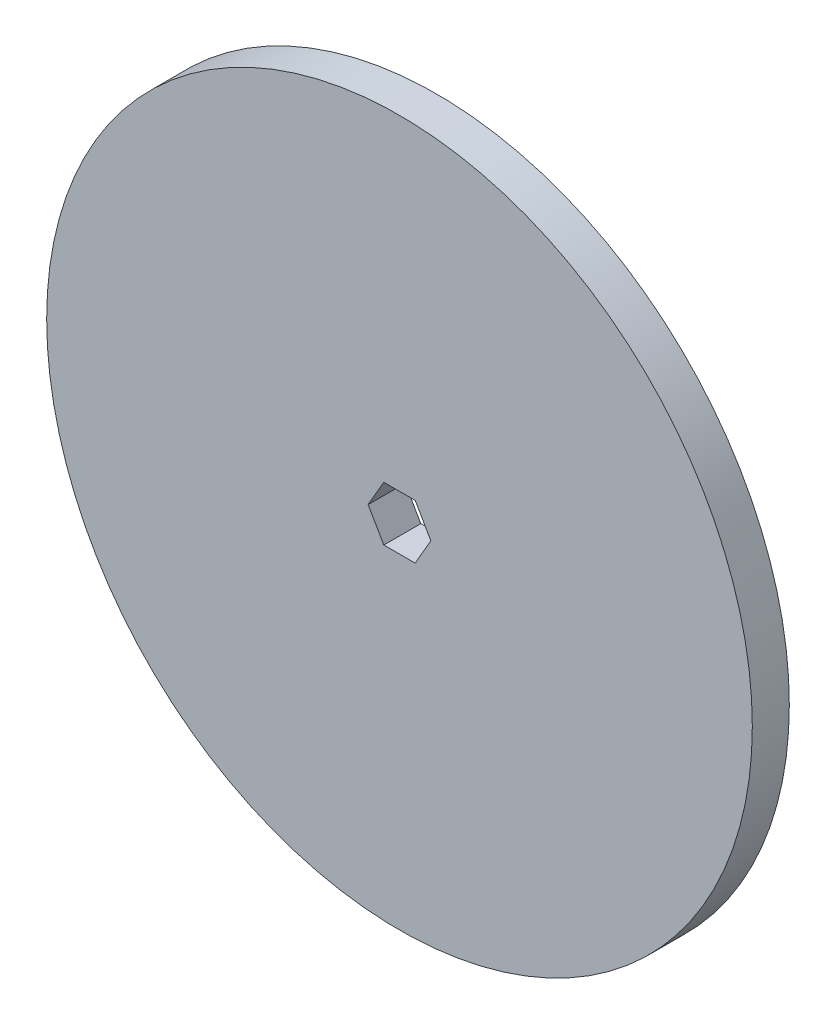
ISO-10303-21;
HEADER;
FILE_DESCRIPTION(('STEP AP214'),'2;1');
FILE_NAME('part.step','',(''),(''),'','','');
FILE_SCHEMA(('AUTOMOTIVE_DESIGN { 1 0 10303 214 1 1 1 1 }'));
ENDSEC;
DATA;
#1=APPLICATION_CONTEXT('core data for automotive mechanical design processes');
#2=APPLICATION_PROTOCOL_DEFINITION('international standard','automotive_design',2000,#1);
#3=PRODUCT_CONTEXT('',#1,'mechanical');
#4=PRODUCT('Part','Part','',(#3));
#5=PRODUCT_RELATED_PRODUCT_CATEGORY('part','',(#4));
#6=PRODUCT_DEFINITION_FORMATION('','',#4);
#7=PRODUCT_DEFINITION_CONTEXT('part definition',#1,'design');
#8=PRODUCT_DEFINITION('design','',#6,#7);
#9=PRODUCT_DEFINITION_SHAPE('','',#8);
#10=(LENGTH_UNIT() NAMED_UNIT(*) SI_UNIT(.MILLI.,.METRE.));
#11=(NAMED_UNIT(*) PLANE_ANGLE_UNIT() SI_UNIT($,.RADIAN.));
#12=(NAMED_UNIT(*) SI_UNIT($,.STERADIAN.) SOLID_ANGLE_UNIT());
#13=UNCERTAINTY_MEASURE_WITH_UNIT(LENGTH_MEASURE(1.E-05),#10,'distance_accuracy_value','');
#14=(GEOMETRIC_REPRESENTATION_CONTEXT(3) GLOBAL_UNCERTAINTY_ASSIGNED_CONTEXT((#13)) GLOBAL_UNIT_ASSIGNED_CONTEXT((#10,
#11,#12)) REPRESENTATION_CONTEXT('',''));
#15=CARTESIAN_POINT('',(0.,0.,0.));
#16=DIRECTION('',(0.,0.,1.));
#17=DIRECTION('',(1.,0.,0.));
#18=AXIS2_PLACEMENT_3D('',#15,#16,#17);
#19=CARTESIAN_POINT('',(0.,0.,5.9944));
#20=DIRECTION('',(0.,0.,-1.));
#21=DIRECTION('',(-1.,0.,0.));
#22=AXIS2_PLACEMENT_3D('',#19,#20,#21);
#23=CYLINDRICAL_SURFACE('',#22,57.15);
#24=CARTESIAN_POINT('',(0.,0.,5.9944));
#25=DIRECTION('',(0.,0.,1.));
#26=DIRECTION('',(1.,0.,0.));
#27=AXIS2_PLACEMENT_3D('',#24,#25,#26);
#28=CIRCLE('',#27,57.15);
#29=CARTESIAN_POINT('',(-57.15,0.,5.9944));
#30=VERTEX_POINT('',#29);
#31=EDGE_CURVE('E11',#30,#30,#28,.T.);
#32=CARTESIAN_POINT('',(0.,0.,0.));
#33=DIRECTION('',(0.,0.,1.));
#34=DIRECTION('',(1.,0.,0.));
#35=AXIS2_PLACEMENT_3D('',#32,#33,#34);
#36=CIRCLE('',#35,57.15);
#37=CARTESIAN_POINT('',(-57.15,0.,0.));
#38=VERTEX_POINT('',#37);
#39=EDGE_CURVE('E35',#38,#38,#36,.T.);
#40=CARTESIAN_POINT('',(-57.15,0.,5.9944));
#41=CARTESIAN_POINT('',(-57.15,0.,5.93195833333333));
#42=CARTESIAN_POINT('',(-57.15,0.,5.86951666666667));
#43=CARTESIAN_POINT('',(-57.15,0.,5.74463333333333));
#44=CARTESIAN_POINT('',(-57.15,0.,5.68219166666667));
#45=CARTESIAN_POINT('',(-57.15,0.,5.55730833333333));
#46=CARTESIAN_POINT('',(-57.15,0.,5.49486666666667));
#47=CARTESIAN_POINT('',(-57.15,0.,5.36998333333333));
#48=CARTESIAN_POINT('',(-57.15,0.,5.30754166666667));
#49=CARTESIAN_POINT('',(-57.15,0.,5.18265833333333));
#50=CARTESIAN_POINT('',(-57.15,0.,5.12021666666667));
#51=CARTESIAN_POINT('',(-57.15,0.,4.99533333333333));
#52=CARTESIAN_POINT('',(-57.15,0.,4.93289166666667));
#53=CARTESIAN_POINT('',(-57.15,0.,4.80800833333333));
#54=CARTESIAN_POINT('',(-57.15,0.,4.74556666666667));
#55=CARTESIAN_POINT('',(-57.15,0.,4.62068333333333));
#56=CARTESIAN_POINT('',(-57.15,0.,4.55824166666667));
#57=CARTESIAN_POINT('',(-57.15,0.,4.43335833333333));
#58=CARTESIAN_POINT('',(-57.15,0.,4.37091666666667));
#59=CARTESIAN_POINT('',(-57.15,0.,4.24603333333333));
#60=CARTESIAN_POINT('',(-57.15,0.,4.18359166666667));
#61=CARTESIAN_POINT('',(-57.15,0.,4.05870833333333));
#62=CARTESIAN_POINT('',(-57.15,0.,3.99626666666667));
#63=CARTESIAN_POINT('',(-57.15,0.,3.87138333333333));
#64=CARTESIAN_POINT('',(-57.15,0.,3.80894166666667));
#65=CARTESIAN_POINT('',(-57.15,0.,3.68405833333333));
#66=CARTESIAN_POINT('',(-57.15,0.,3.62161666666667));
#67=CARTESIAN_POINT('',(-57.15,0.,3.49673333333333));
#68=CARTESIAN_POINT('',(-57.15,0.,3.43429166666667));
#69=CARTESIAN_POINT('',(-57.15,0.,3.30940833333333));
#70=CARTESIAN_POINT('',(-57.15,0.,3.24696666666667));
#71=CARTESIAN_POINT('',(-57.15,0.,3.12208333333333));
#72=CARTESIAN_POINT('',(-57.15,0.,3.05964166666667));
#73=CARTESIAN_POINT('',(-57.15,0.,2.93475833333333));
#74=CARTESIAN_POINT('',(-57.15,0.,2.87231666666667));
#75=CARTESIAN_POINT('',(-57.15,0.,2.74743333333333));
#76=CARTESIAN_POINT('',(-57.15,0.,2.68499166666667));
#77=CARTESIAN_POINT('',(-57.15,0.,2.56010833333333));
#78=CARTESIAN_POINT('',(-57.15,0.,2.49766666666667));
#79=CARTESIAN_POINT('',(-57.15,0.,2.37278333333333));
#80=CARTESIAN_POINT('',(-57.15,0.,2.31034166666667));
#81=CARTESIAN_POINT('',(-57.15,0.,2.18545833333333));
#82=CARTESIAN_POINT('',(-57.15,0.,2.12301666666667));
#83=CARTESIAN_POINT('',(-57.15,0.,1.99813333333333));
#84=CARTESIAN_POINT('',(-57.15,0.,1.93569166666667));
#85=CARTESIAN_POINT('',(-57.15,0.,1.81080833333333));
#86=CARTESIAN_POINT('',(-57.15,0.,1.74836666666667));
#87=CARTESIAN_POINT('',(-57.15,0.,1.62348333333333));
#88=CARTESIAN_POINT('',(-57.15,0.,1.56104166666667));
#89=CARTESIAN_POINT('',(-57.15,0.,1.43615833333333));
#90=CARTESIAN_POINT('',(-57.15,0.,1.37371666666667));
#91=CARTESIAN_POINT('',(-57.15,0.,1.24883333333333));
#92=CARTESIAN_POINT('',(-57.15,0.,1.18639166666667));
#93=CARTESIAN_POINT('',(-57.15,0.,1.06150833333333));
#94=CARTESIAN_POINT('',(-57.15,0.,0.999066666666667));
#95=CARTESIAN_POINT('',(-57.15,0.,0.874183333333333));
#96=CARTESIAN_POINT('',(-57.15,0.,0.811741666666666));
#97=CARTESIAN_POINT('',(-57.15,0.,0.686858333333333));
#98=CARTESIAN_POINT('',(-57.15,0.,0.624416666666667));
#99=CARTESIAN_POINT('',(-57.15,0.,0.499533333333333));
#100=CARTESIAN_POINT('',(-57.15,0.,0.437091666666667));
#101=CARTESIAN_POINT('',(-57.15,0.,0.312208333333333));
#102=CARTESIAN_POINT('',(-57.15,0.,0.249766666666667));
#103=CARTESIAN_POINT('',(-57.15,0.,0.124883333333334));
#104=CARTESIAN_POINT('',(-57.15,0.,0.0624416666666667));
#105=CARTESIAN_POINT('',(-57.15,0.,0.));
#106=B_SPLINE_CURVE_WITH_KNOTS('',3,(#40,#41,#42,#43,#44,#45,#46,#47,#48,#49,#50,#51,#52,#53,
#54,#55,#56,#57,#58,#59,#60,#61,#62,#63,#64,#65,#66,#67,#68,#69,#70,#71,#72,#73,#74,#75,#76,#77,
#78,#79,#80,#81,#82,#83,#84,#85,#86,#87,#88,#89,#90,#91,#92,#93,#94,#95,#96,#97,#98,#99,#100,
#101,#102,#103,#104,#105),.UNSPECIFIED.,.F.,.F.,(4,2,2,2,2,2,2,2,2,2,2,2,2,2,2,2,2,2,2,2,2,2,2,
2,2,2,2,2,2,2,2,2,4),(0.,0.187325,0.374650000000001,0.561975,0.749300000000001,
0.936625000000001,1.12395,1.311275,1.4986,1.685925,1.87325,2.060575,2.2479,2.435225,2.62255,
2.809875,2.9972,3.184525,3.37185,3.559175,3.7465,3.933825,4.12115,4.308475,4.4958,4.683125,
4.87045,5.057775,5.2451,5.432425,5.61975,5.807075,5.9944),.UNSPECIFIED.);
#107=EDGE_CURVE('BSEAM32',#30,#38,#106,.T.);
#108=ORIENTED_EDGE('',*,*,#31,.F.);
#109=ORIENTED_EDGE('',*,*,#39,.T.);
#110=ORIENTED_EDGE('',*,*,#107,.T.);
#111=ORIENTED_EDGE('',*,*,#107,.F.);
#112=EDGE_LOOP('',(#108,#110,#109,#111));
#113=FACE_BOUND('',#112,.T.);
#114=ADVANCED_FACE('F32',(#113),#23,.T.);
#115=CARTESIAN_POINT('',(0.,0.,5.9944));
#116=DIRECTION('',(0.,0.,1.));
#117=DIRECTION('',(1.,0.,0.));
#118=AXIS2_PLACEMENT_3D('',#115,#116,#117);
#119=PLANE('',#118);
#120=DIRECTION('',(0.5,0.866025403784439,0.));
#121=VECTOR('',#120,1.);
#122=CARTESIAN_POINT('',(2.54,-4.39940905122495,5.9944));
#123=LINE('',#122,#121);
#124=CARTESIAN_POINT('',(2.54,-4.39940905122495,5.9944));
#125=VERTEX_POINT('',#124);
#126=CARTESIAN_POINT('',(5.08,0.,5.9944));
#127=VERTEX_POINT('',#126);
#128=EDGE_CURVE('E46',#125,#127,#123,.T.);
#129=ORIENTED_EDGE('',*,*,#128,.F.);
#130=DIRECTION('',(1.,0.,0.));
#131=VECTOR('',#130,1.);
#132=CARTESIAN_POINT('',(-2.54,-4.39940905122495,5.9944));
#133=LINE('',#132,#131);
#134=CARTESIAN_POINT('',(-2.54,-4.39940905122495,5.9944));
#135=VERTEX_POINT('',#134);
#136=EDGE_CURVE('E103',#135,#125,#133,.T.);
#137=ORIENTED_EDGE('',*,*,#136,.F.);
#138=DIRECTION('',(0.5,-0.866025403784439,0.));
#139=VECTOR('',#138,1.);
#140=CARTESIAN_POINT('',(-5.08,0.,5.9944));
#141=LINE('',#140,#139);
#142=CARTESIAN_POINT('',(-5.08,0.,5.9944));
#143=VERTEX_POINT('',#142);
#144=EDGE_CURVE('E106',#143,#135,#141,.T.);
#145=ORIENTED_EDGE('',*,*,#144,.F.);
#146=DIRECTION('',(-0.5,-0.866025403784439,0.));
#147=VECTOR('',#146,1.);
#148=CARTESIAN_POINT('',(-2.54,4.39940905122495,5.9944));
#149=LINE('',#148,#147);
#150=CARTESIAN_POINT('',(-2.54,4.39940905122495,5.9944));
#151=VERTEX_POINT('',#150);
#152=EDGE_CURVE('E122',#151,#143,#149,.T.);
#153=ORIENTED_EDGE('',*,*,#152,.F.);
#154=DIRECTION('',(-1.,0.,0.));
#155=VECTOR('',#154,1.);
#156=CARTESIAN_POINT('',(2.54,4.39940905122495,5.9944));
#157=LINE('',#156,#155);
#158=CARTESIAN_POINT('',(2.54,4.39940905122495,5.9944));
#159=VERTEX_POINT('',#158);
#160=EDGE_CURVE('E119',#159,#151,#157,.T.);
#161=ORIENTED_EDGE('',*,*,#160,.F.);
#162=DIRECTION('',(-0.5,0.866025403784439,0.));
#163=VECTOR('',#162,1.);
#164=CARTESIAN_POINT('',(5.08,0.,5.9944));
#165=LINE('',#164,#163);
#166=EDGE_CURVE('E117',#127,#159,#165,.T.);
#167=ORIENTED_EDGE('',*,*,#166,.F.);
#168=EDGE_LOOP('',(#129,#137,#145,#153,#161,#167));
#169=FACE_BOUND('',#168,.T.);
#170=ORIENTED_EDGE('',*,*,#31,.T.);
#171=EDGE_LOOP('',(#170));
#172=FACE_BOUND('',#171,.T.);
#173=ADVANCED_FACE('F139',(#169,#172),#119,.T.);
#174=CARTESIAN_POINT('',(0.,0.,0.));
#175=DIRECTION('',(0.,0.,1.));
#176=DIRECTION('',(1.,0.,0.));
#177=AXIS2_PLACEMENT_3D('',#174,#175,#176);
#178=PLANE('',#177);
#179=DIRECTION('',(1.,0.,0.));
#180=VECTOR('',#179,1.);
#181=CARTESIAN_POINT('',(-2.54,-4.39940905122495,0.));
#182=LINE('',#181,#180);
#183=CARTESIAN_POINT('',(-2.54,-4.39940905122495,0.));
#184=VERTEX_POINT('',#183);
#185=CARTESIAN_POINT('',(2.54,-4.39940905122495,0.));
#186=VERTEX_POINT('',#185);
#187=EDGE_CURVE('E92',#184,#186,#182,.T.);
#188=ORIENTED_EDGE('',*,*,#187,.T.);
#189=DIRECTION('',(0.5,0.866025403784439,0.));
#190=VECTOR('',#189,1.);
#191=CARTESIAN_POINT('',(2.54,-4.39940905122495,0.));
#192=LINE('',#191,#190);
#193=CARTESIAN_POINT('',(5.08,0.,0.));
#194=VERTEX_POINT('',#193);
#195=EDGE_CURVE('E86',#186,#194,#192,.T.);
#196=ORIENTED_EDGE('',*,*,#195,.T.);
#197=DIRECTION('',(-0.5,0.866025403784439,0.));
#198=VECTOR('',#197,1.);
#199=CARTESIAN_POINT('',(5.08,0.,0.));
#200=LINE('',#199,#198);
#201=CARTESIAN_POINT('',(2.54,4.39940905122495,0.));
#202=VERTEX_POINT('',#201);
#203=EDGE_CURVE('E95',#194,#202,#200,.T.);
#204=ORIENTED_EDGE('',*,*,#203,.T.);
#205=DIRECTION('',(-1.,0.,0.));
#206=VECTOR('',#205,1.);
#207=CARTESIAN_POINT('',(2.54,4.39940905122495,0.));
#208=LINE('',#207,#206);
#209=CARTESIAN_POINT('',(-2.54,4.39940905122495,0.));
#210=VERTEX_POINT('',#209);
#211=EDGE_CURVE('E54',#202,#210,#208,.T.);
#212=ORIENTED_EDGE('',*,*,#211,.T.);
#213=DIRECTION('',(-0.5,-0.866025403784439,0.));
#214=VECTOR('',#213,1.);
#215=CARTESIAN_POINT('',(-2.54,4.39940905122495,0.));
#216=LINE('',#215,#214);
#217=CARTESIAN_POINT('',(-5.08,0.,0.));
#218=VERTEX_POINT('',#217);
#219=EDGE_CURVE('E110',#210,#218,#216,.T.);
#220=ORIENTED_EDGE('',*,*,#219,.T.);
#221=DIRECTION('',(0.5,-0.866025403784439,0.));
#222=VECTOR('',#221,1.);
#223=CARTESIAN_POINT('',(-5.08,0.,0.));
#224=LINE('',#223,#222);
#225=EDGE_CURVE('E113',#218,#184,#224,.T.);
#226=ORIENTED_EDGE('',*,*,#225,.T.);
#227=EDGE_LOOP('',(#188,#196,#204,#212,#220,#226));
#228=FACE_BOUND('',#227,.T.);
#229=ORIENTED_EDGE('',*,*,#39,.F.);
#230=EDGE_LOOP('',(#229));
#231=FACE_BOUND('',#230,.T.);
#232=ADVANCED_FACE('F99',(#228,#231),#178,.F.);
#233=CARTESIAN_POINT('',(2.54,-4.39940905122495,0.));
#234=DIRECTION('',(0.866025403784439,-0.5,0.));
#235=DIRECTION('',(0.5,0.866025403784439,0.));
#236=AXIS2_PLACEMENT_3D('',#233,#234,#235);
#237=PLANE('',#236);
#238=ORIENTED_EDGE('',*,*,#128,.T.);
#239=DIRECTION('',(0.,0.,1.));
#240=VECTOR('',#239,1.);
#241=CARTESIAN_POINT('',(5.08,0.,0.));
#242=LINE('',#241,#240);
#243=EDGE_CURVE('E82',#194,#127,#242,.T.);
#244=ORIENTED_EDGE('',*,*,#243,.F.);
#245=ORIENTED_EDGE('',*,*,#195,.F.);
#246=DIRECTION('',(0.,0.,1.));
#247=VECTOR('',#246,1.);
#248=CARTESIAN_POINT('',(2.54,-4.39940905122495,0.));
#249=LINE('',#248,#247);
#250=EDGE_CURVE('E127',#186,#125,#249,.T.);
#251=ORIENTED_EDGE('',*,*,#250,.T.);
#252=EDGE_LOOP('',(#238,#244,#245,#251));
#253=FACE_BOUND('',#252,.T.);
#254=ADVANCED_FACE('F84',(#253),#237,.F.);
#255=CARTESIAN_POINT('',(-2.54,-4.39940905122495,0.));
#256=DIRECTION('',(0.,-1.,0.));
#257=DIRECTION('',(1.,0.,0.));
#258=AXIS2_PLACEMENT_3D('',#255,#256,#257);
#259=PLANE('',#258);
#260=ORIENTED_EDGE('',*,*,#136,.T.);
#261=ORIENTED_EDGE('',*,*,#250,.F.);
#262=ORIENTED_EDGE('',*,*,#187,.F.);
#263=DIRECTION('',(0.,0.,1.));
#264=VECTOR('',#263,1.);
#265=CARTESIAN_POINT('',(-2.54,-4.39940905122495,0.));
#266=LINE('',#265,#264);
#267=EDGE_CURVE('E129',#184,#135,#266,.T.);
#268=ORIENTED_EDGE('',*,*,#267,.T.);
#269=EDGE_LOOP('',(#260,#261,#262,#268));
#270=FACE_BOUND('',#269,.T.);
#271=ADVANCED_FACE('F150',(#270),#259,.F.);
#272=CARTESIAN_POINT('',(-5.08,0.,0.));
#273=DIRECTION('',(-0.866025403784438,-0.5,0.));
#274=DIRECTION('',(0.5,-0.866025403784439,0.));
#275=AXIS2_PLACEMENT_3D('',#272,#273,#274);
#276=PLANE('',#275);
#277=ORIENTED_EDGE('',*,*,#144,.T.);
#278=ORIENTED_EDGE('',*,*,#267,.F.);
#279=ORIENTED_EDGE('',*,*,#225,.F.);
#280=DIRECTION('',(0.,0.,1.));
#281=VECTOR('',#280,1.);
#282=CARTESIAN_POINT('',(-5.08,0.,0.));
#283=LINE('',#282,#281);
#284=EDGE_CURVE('E131',#218,#143,#283,.T.);
#285=ORIENTED_EDGE('',*,*,#284,.T.);
#286=EDGE_LOOP('',(#277,#278,#279,#285));
#287=FACE_BOUND('',#286,.T.);
#288=ADVANCED_FACE('F148',(#287),#276,.F.);
#289=CARTESIAN_POINT('',(-2.54,4.39940905122495,0.));
#290=DIRECTION('',(-0.866025403784439,0.5,0.));
#291=DIRECTION('',(-0.5,-0.866025403784439,0.));
#292=AXIS2_PLACEMENT_3D('',#289,#290,#291);
#293=PLANE('',#292);
#294=ORIENTED_EDGE('',*,*,#152,.T.);
#295=ORIENTED_EDGE('',*,*,#284,.F.);
#296=ORIENTED_EDGE('',*,*,#219,.F.);
#297=DIRECTION('',(0.,0.,1.));
#298=VECTOR('',#297,1.);
#299=CARTESIAN_POINT('',(-2.54,4.39940905122495,0.));
#300=LINE('',#299,#298);
#301=EDGE_CURVE('E133',#210,#151,#300,.T.);
#302=ORIENTED_EDGE('',*,*,#301,.T.);
#303=EDGE_LOOP('',(#294,#295,#296,#302));
#304=FACE_BOUND('',#303,.T.);
#305=ADVANCED_FACE('F144',(#304),#293,.F.);
#306=CARTESIAN_POINT('',(2.54,4.39940905122495,0.));
#307=DIRECTION('',(0.,1.,0.));
#308=DIRECTION('',(0.,0.,1.));
#309=AXIS2_PLACEMENT_3D('',#306,#307,#308);
#310=PLANE('',#309);
#311=ORIENTED_EDGE('',*,*,#160,.T.);
#312=ORIENTED_EDGE('',*,*,#301,.F.);
#313=ORIENTED_EDGE('',*,*,#211,.F.);
#314=DIRECTION('',(0.,0.,1.));
#315=VECTOR('',#314,1.);
#316=CARTESIAN_POINT('',(2.54,4.39940905122495,0.));
#317=LINE('',#316,#315);
#318=EDGE_CURVE('E91',#202,#159,#317,.T.);
#319=ORIENTED_EDGE('',*,*,#318,.T.);
#320=EDGE_LOOP('',(#311,#312,#313,#319));
#321=FACE_BOUND('',#320,.T.);
#322=ADVANCED_FACE('F135',(#321),#310,.F.);
#323=CARTESIAN_POINT('',(5.08,0.,0.));
#324=DIRECTION('',(0.866025403784439,0.5,0.));
#325=DIRECTION('',(-0.5,0.866025403784439,0.));
#326=AXIS2_PLACEMENT_3D('',#323,#324,#325);
#327=PLANE('',#326);
#328=ORIENTED_EDGE('',*,*,#166,.T.);
#329=ORIENTED_EDGE('',*,*,#318,.F.);
#330=ORIENTED_EDGE('',*,*,#203,.F.);
#331=ORIENTED_EDGE('',*,*,#243,.T.);
#332=EDGE_LOOP('',(#328,#329,#330,#331));
#333=FACE_BOUND('',#332,.T.);
#334=ADVANCED_FACE('F96',(#333),#327,.F.);
#335=CLOSED_SHELL('',(#114,#173,#232,#254,#271,#288,#305,#322,#334));
#336=MANIFOLD_SOLID_BREP('B2',#335);
#337=ADVANCED_BREP_SHAPE_REPRESENTATION('',(#18,#336),#14);
#338=SHAPE_DEFINITION_REPRESENTATION(#9,#337);
ENDSEC;
END-ISO-10303-21;
